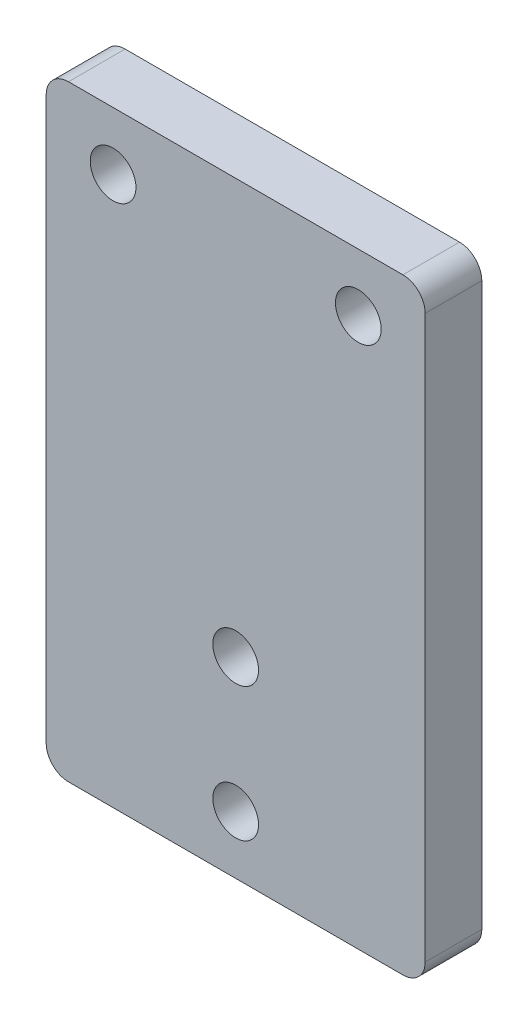
ISO-10303-21;
HEADER;
FILE_DESCRIPTION(('STEP AP214'),'2;1');
FILE_NAME('part.step','',(''),(''),'','','');
FILE_SCHEMA(('AUTOMOTIVE_DESIGN { 1 0 10303 214 1 1 1 1 }'));
ENDSEC;
DATA;
#1=APPLICATION_CONTEXT('core data for automotive mechanical design processes');
#2=APPLICATION_PROTOCOL_DEFINITION('international standard','automotive_design',2000,#1);
#3=PRODUCT_CONTEXT('',#1,'mechanical');
#4=PRODUCT('Part','Part','',(#3));
#5=PRODUCT_RELATED_PRODUCT_CATEGORY('part','',(#4));
#6=PRODUCT_DEFINITION_FORMATION('','',#4);
#7=PRODUCT_DEFINITION_CONTEXT('part definition',#1,'design');
#8=PRODUCT_DEFINITION('design','',#6,#7);
#9=PRODUCT_DEFINITION_SHAPE('','',#8);
#10=(LENGTH_UNIT() NAMED_UNIT(*) SI_UNIT(.MILLI.,.METRE.));
#11=(NAMED_UNIT(*) PLANE_ANGLE_UNIT() SI_UNIT($,.RADIAN.));
#12=(NAMED_UNIT(*) SI_UNIT($,.STERADIAN.) SOLID_ANGLE_UNIT());
#13=UNCERTAINTY_MEASURE_WITH_UNIT(LENGTH_MEASURE(1.E-05),#10,'distance_accuracy_value','');
#14=(GEOMETRIC_REPRESENTATION_CONTEXT(3) GLOBAL_UNCERTAINTY_ASSIGNED_CONTEXT((#13)) GLOBAL_UNIT_ASSIGNED_CONTEXT((#10,
#11,#12)) REPRESENTATION_CONTEXT('',''));
#15=CARTESIAN_POINT('',(0.,0.,0.));
#16=DIRECTION('',(0.,0.,1.));
#17=DIRECTION('',(1.,0.,0.));
#18=AXIS2_PLACEMENT_3D('',#15,#16,#17);
#19=CARTESIAN_POINT('',(37.5,-63.,6.35));
#20=DIRECTION('',(0.,0.,1.));
#21=DIRECTION('',(1.,0.,0.));
#22=AXIS2_PLACEMENT_3D('',#19,#20,#21);
#23=PLANE('',#22);
#24=CARTESIAN_POINT('',(-27.5,55.,6.35));
#25=DIRECTION('',(0.,0.,1.));
#26=DIRECTION('',(1.,0.,0.));
#27=AXIS2_PLACEMENT_3D('',#24,#25,#26);
#28=CIRCLE('',#27,5.125);
#29=CARTESIAN_POINT('',(-22.375,55.,6.35));
#30=VERTEX_POINT('',#29);
#31=EDGE_CURVE('E188',#30,#30,#28,.T.);
#32=ORIENTED_EDGE('',*,*,#31,.F.);
#33=EDGE_LOOP('',(#32));
#34=FACE_BOUND('',#33,.T.);
#35=CARTESIAN_POINT('',(0.,-55.,6.35));
#36=DIRECTION('',(0.,0.,1.));
#37=DIRECTION('',(1.,0.,0.));
#38=AXIS2_PLACEMENT_3D('',#35,#36,#37);
#39=CIRCLE('',#38,5.125);
#40=CARTESIAN_POINT('',(5.12500000000001,-55.,6.35));
#41=VERTEX_POINT('',#40);
#42=EDGE_CURVE('E134',#41,#41,#39,.T.);
#43=ORIENTED_EDGE('',*,*,#42,.F.);
#44=EDGE_LOOP('',(#43));
#45=FACE_BOUND('',#44,.T.);
#46=CARTESIAN_POINT('',(37.5,-63.,6.35));
#47=DIRECTION('',(0.,0.,1.));
#48=DIRECTION('',(1.,0.,0.));
#49=AXIS2_PLACEMENT_3D('',#46,#47,#48);
#50=CIRCLE('',#49,5.);
#51=CARTESIAN_POINT('',(37.5,-68.,6.35));
#52=VERTEX_POINT('',#51);
#53=CARTESIAN_POINT('',(42.5,-63.,6.35));
#54=VERTEX_POINT('',#53);
#55=EDGE_CURVE('E145',#52,#54,#50,.T.);
#56=ORIENTED_EDGE('',*,*,#55,.T.);
#57=DIRECTION('',(0.,1.,0.));
#58=VECTOR('',#57,1.);
#59=CARTESIAN_POINT('',(42.5,63.,6.35));
#60=LINE('',#59,#58);
#61=CARTESIAN_POINT('',(42.5,63.,6.35));
#62=VERTEX_POINT('',#61);
#63=EDGE_CURVE('E93',#54,#62,#60,.T.);
#64=ORIENTED_EDGE('',*,*,#63,.T.);
#65=CARTESIAN_POINT('',(37.5,63.,6.35));
#66=DIRECTION('',(0.,0.,1.));
#67=DIRECTION('',(-1.,0.,0.));
#68=AXIS2_PLACEMENT_3D('',#65,#66,#67);
#69=CIRCLE('',#68,5.);
#70=CARTESIAN_POINT('',(37.5,68.,6.35));
#71=VERTEX_POINT('',#70);
#72=EDGE_CURVE('E160',#62,#71,#69,.T.);
#73=ORIENTED_EDGE('',*,*,#72,.T.);
#74=DIRECTION('',(-1.,0.,0.));
#75=VECTOR('',#74,1.);
#76=CARTESIAN_POINT('',(-37.5,68.,6.35));
#77=LINE('',#76,#75);
#78=CARTESIAN_POINT('',(-37.5,68.,6.35));
#79=VERTEX_POINT('',#78);
#80=EDGE_CURVE('E173',#71,#79,#77,.T.);
#81=ORIENTED_EDGE('',*,*,#80,.T.);
#82=CARTESIAN_POINT('',(-37.5,63.,6.35));
#83=DIRECTION('',(0.,0.,1.));
#84=DIRECTION('',(1.,0.,0.));
#85=AXIS2_PLACEMENT_3D('',#82,#83,#84);
#86=CIRCLE('',#85,5.);
#87=CARTESIAN_POINT('',(-42.5,63.,6.35));
#88=VERTEX_POINT('',#87);
#89=EDGE_CURVE('E112',#79,#88,#86,.T.);
#90=ORIENTED_EDGE('',*,*,#89,.T.);
#91=DIRECTION('',(0.,-1.,0.));
#92=VECTOR('',#91,1.);
#93=CARTESIAN_POINT('',(-42.5,63.,6.35));
#94=LINE('',#93,#92);
#95=CARTESIAN_POINT('',(-42.5,-63.,6.35));
#96=VERTEX_POINT('',#95);
#97=EDGE_CURVE('E106',#88,#96,#94,.T.);
#98=ORIENTED_EDGE('',*,*,#97,.T.);
#99=CARTESIAN_POINT('',(-37.5,-63.,6.35));
#100=DIRECTION('',(0.,0.,1.));
#101=DIRECTION('',(1.,0.,0.));
#102=AXIS2_PLACEMENT_3D('',#99,#100,#101);
#103=CIRCLE('',#102,5.);
#104=CARTESIAN_POINT('',(-37.5,-68.,6.35));
#105=VERTEX_POINT('',#104);
#106=EDGE_CURVE('E110',#96,#105,#103,.T.);
#107=ORIENTED_EDGE('',*,*,#106,.T.);
#108=DIRECTION('',(1.,0.,0.));
#109=VECTOR('',#108,1.);
#110=CARTESIAN_POINT('',(-37.5,-68.,6.35));
#111=LINE('',#110,#109);
#112=EDGE_CURVE('E50',#105,#52,#111,.T.);
#113=ORIENTED_EDGE('',*,*,#112,.T.);
#114=EDGE_LOOP('',(#56,#64,#73,#81,#90,#98,#107,#113));
#115=FACE_BOUND('',#114,.T.);
#116=CARTESIAN_POINT('',(0.,-25.,6.35));
#117=DIRECTION('',(0.,0.,1.));
#118=DIRECTION('',(1.,0.,0.));
#119=AXIS2_PLACEMENT_3D('',#116,#117,#118);
#120=CIRCLE('',#119,5.125);
#121=CARTESIAN_POINT('',(5.125,-25.,6.35));
#122=VERTEX_POINT('',#121);
#123=EDGE_CURVE('E182',#122,#122,#120,.T.);
#124=ORIENTED_EDGE('',*,*,#123,.F.);
#125=EDGE_LOOP('',(#124));
#126=FACE_BOUND('',#125,.T.);
#127=CARTESIAN_POINT('',(27.5,55.,6.35));
#128=DIRECTION('',(0.,0.,1.));
#129=DIRECTION('',(-1.,0.,0.));
#130=AXIS2_PLACEMENT_3D('',#127,#128,#129);
#131=CIRCLE('',#130,5.125);
#132=CARTESIAN_POINT('',(22.375,55.,6.35));
#133=VERTEX_POINT('',#132);
#134=EDGE_CURVE('E194',#133,#133,#131,.T.);
#135=ORIENTED_EDGE('',*,*,#134,.F.);
#136=EDGE_LOOP('',(#135));
#137=FACE_BOUND('',#136,.T.);
#138=ADVANCED_FACE('F33',(#34,#45,#115,#126,#137),#23,.T.);
#139=CARTESIAN_POINT('',(37.5,-63.,-6.35));
#140=DIRECTION('',(0.,0.,1.));
#141=DIRECTION('',(1.,0.,0.));
#142=AXIS2_PLACEMENT_3D('',#139,#140,#141);
#143=PLANE('',#142);
#144=CARTESIAN_POINT('',(37.5,-63.,-6.35));
#145=DIRECTION('',(0.,0.,1.));
#146=DIRECTION('',(1.,0.,0.));
#147=AXIS2_PLACEMENT_3D('',#144,#145,#146);
#148=CIRCLE('',#147,5.);
#149=CARTESIAN_POINT('',(37.5,-68.,-6.35));
#150=VERTEX_POINT('',#149);
#151=CARTESIAN_POINT('',(42.5,-63.,-6.35));
#152=VERTEX_POINT('',#151);
#153=EDGE_CURVE('E130',#150,#152,#148,.T.);
#154=ORIENTED_EDGE('',*,*,#153,.F.);
#155=DIRECTION('',(1.,0.,0.));
#156=VECTOR('',#155,1.);
#157=CARTESIAN_POINT('',(-37.5,-68.,-6.35));
#158=LINE('',#157,#156);
#159=CARTESIAN_POINT('',(-37.5,-68.,-6.35));
#160=VERTEX_POINT('',#159);
#161=EDGE_CURVE('E85',#160,#150,#158,.T.);
#162=ORIENTED_EDGE('',*,*,#161,.F.);
#163=CARTESIAN_POINT('',(-37.5,-63.,-6.35));
#164=DIRECTION('',(0.,0.,1.));
#165=DIRECTION('',(1.,0.,0.));
#166=AXIS2_PLACEMENT_3D('',#163,#164,#165);
#167=CIRCLE('',#166,5.);
#168=CARTESIAN_POINT('',(-42.5,-63.,-6.35));
#169=VERTEX_POINT('',#168);
#170=EDGE_CURVE('E79',#169,#160,#167,.T.);
#171=ORIENTED_EDGE('',*,*,#170,.F.);
#172=DIRECTION('',(0.,-1.,0.));
#173=VECTOR('',#172,1.);
#174=CARTESIAN_POINT('',(-42.5,63.,-6.35));
#175=LINE('',#174,#173);
#176=CARTESIAN_POINT('',(-42.5,63.,-6.35));
#177=VERTEX_POINT('',#176);
#178=EDGE_CURVE('E120',#177,#169,#175,.T.);
#179=ORIENTED_EDGE('',*,*,#178,.F.);
#180=CARTESIAN_POINT('',(-37.5,63.,-6.35));
#181=DIRECTION('',(0.,0.,1.));
#182=DIRECTION('',(1.,0.,0.));
#183=AXIS2_PLACEMENT_3D('',#180,#181,#182);
#184=CIRCLE('',#183,5.);
#185=CARTESIAN_POINT('',(-37.5,68.,-6.35));
#186=VERTEX_POINT('',#185);
#187=EDGE_CURVE('E140',#186,#177,#184,.T.);
#188=ORIENTED_EDGE('',*,*,#187,.F.);
#189=DIRECTION('',(-1.,0.,0.));
#190=VECTOR('',#189,1.);
#191=CARTESIAN_POINT('',(-37.5,68.,-6.35));
#192=LINE('',#191,#190);
#193=CARTESIAN_POINT('',(37.5,68.,-6.35));
#194=VERTEX_POINT('',#193);
#195=EDGE_CURVE('E138',#194,#186,#192,.T.);
#196=ORIENTED_EDGE('',*,*,#195,.F.);
#197=CARTESIAN_POINT('',(37.5,63.,-6.35));
#198=DIRECTION('',(0.,0.,1.));
#199=DIRECTION('',(-1.,0.,0.));
#200=AXIS2_PLACEMENT_3D('',#197,#198,#199);
#201=CIRCLE('',#200,5.);
#202=CARTESIAN_POINT('',(42.5,63.,-6.35));
#203=VERTEX_POINT('',#202);
#204=EDGE_CURVE('E136',#203,#194,#201,.T.);
#205=ORIENTED_EDGE('',*,*,#204,.F.);
#206=DIRECTION('',(0.,1.,0.));
#207=VECTOR('',#206,1.);
#208=CARTESIAN_POINT('',(42.5,63.,-6.35));
#209=LINE('',#208,#207);
#210=EDGE_CURVE('E133',#152,#203,#209,.T.);
#211=ORIENTED_EDGE('',*,*,#210,.F.);
#212=EDGE_LOOP('',(#154,#162,#171,#179,#188,#196,#205,#211));
#213=FACE_BOUND('',#212,.T.);
#214=CARTESIAN_POINT('',(0.,-55.,-6.35));
#215=DIRECTION('',(0.,0.,1.));
#216=DIRECTION('',(1.,0.,0.));
#217=AXIS2_PLACEMENT_3D('',#214,#215,#216);
#218=CIRCLE('',#217,5.125);
#219=CARTESIAN_POINT('',(5.12500000000001,-55.,-6.35));
#220=VERTEX_POINT('',#219);
#221=EDGE_CURVE('E179',#220,#220,#218,.T.);
#222=ORIENTED_EDGE('',*,*,#221,.T.);
#223=EDGE_LOOP('',(#222));
#224=FACE_BOUND('',#223,.T.);
#225=CARTESIAN_POINT('',(0.,-25.,-6.35));
#226=DIRECTION('',(0.,0.,1.));
#227=DIRECTION('',(1.,0.,0.));
#228=AXIS2_PLACEMENT_3D('',#225,#226,#227);
#229=CIRCLE('',#228,5.125);
#230=CARTESIAN_POINT('',(5.125,-25.,-6.35));
#231=VERTEX_POINT('',#230);
#232=EDGE_CURVE('E185',#231,#231,#229,.T.);
#233=ORIENTED_EDGE('',*,*,#232,.T.);
#234=EDGE_LOOP('',(#233));
#235=FACE_BOUND('',#234,.T.);
#236=CARTESIAN_POINT('',(-27.5,55.,-6.35));
#237=DIRECTION('',(0.,0.,1.));
#238=DIRECTION('',(1.,0.,0.));
#239=AXIS2_PLACEMENT_3D('',#236,#237,#238);
#240=CIRCLE('',#239,5.125);
#241=CARTESIAN_POINT('',(-22.375,55.,-6.35));
#242=VERTEX_POINT('',#241);
#243=EDGE_CURVE('E191',#242,#242,#240,.T.);
#244=ORIENTED_EDGE('',*,*,#243,.T.);
#245=EDGE_LOOP('',(#244));
#246=FACE_BOUND('',#245,.T.);
#247=CARTESIAN_POINT('',(27.5,55.,-6.35));
#248=DIRECTION('',(0.,0.,1.));
#249=DIRECTION('',(-1.,0.,0.));
#250=AXIS2_PLACEMENT_3D('',#247,#248,#249);
#251=CIRCLE('',#250,5.125);
#252=CARTESIAN_POINT('',(22.375,55.,-6.35));
#253=VERTEX_POINT('',#252);
#254=EDGE_CURVE('E197',#253,#253,#251,.T.);
#255=ORIENTED_EDGE('',*,*,#254,.T.);
#256=EDGE_LOOP('',(#255));
#257=FACE_BOUND('',#256,.T.);
#258=ADVANCED_FACE('F164',(#213,#224,#235,#246,#257),#143,.F.);
#259=CARTESIAN_POINT('',(37.5,-63.,6.35));
#260=DIRECTION('',(0.,0.,-1.));
#261=DIRECTION('',(-1.,0.,0.));
#262=AXIS2_PLACEMENT_3D('',#259,#260,#261);
#263=CYLINDRICAL_SURFACE('',#262,5.);
#264=ORIENTED_EDGE('',*,*,#153,.T.);
#265=DIRECTION('',(0.,0.,-1.));
#266=VECTOR('',#265,1.);
#267=CARTESIAN_POINT('',(42.5,-63.,6.35));
#268=LINE('',#267,#266);
#269=EDGE_CURVE('E11',#54,#152,#268,.T.);
#270=ORIENTED_EDGE('',*,*,#269,.F.);
#271=ORIENTED_EDGE('',*,*,#55,.F.);
#272=DIRECTION('',(0.,0.,-1.));
#273=VECTOR('',#272,1.);
#274=CARTESIAN_POINT('',(37.5,-68.,6.35));
#275=LINE('',#274,#273);
#276=EDGE_CURVE('E126',#52,#150,#275,.T.);
#277=ORIENTED_EDGE('',*,*,#276,.T.);
#278=EDGE_LOOP('',(#264,#270,#271,#277));
#279=FACE_BOUND('',#278,.T.);
#280=ADVANCED_FACE('F35',(#279),#263,.T.);
#281=CARTESIAN_POINT('',(42.5,63.,6.35));
#282=DIRECTION('',(-1.,0.,0.));
#283=DIRECTION('',(0.,-1.,0.));
#284=AXIS2_PLACEMENT_3D('',#281,#282,#283);
#285=PLANE('',#284);
#286=ORIENTED_EDGE('',*,*,#210,.T.);
#287=DIRECTION('',(0.,0.,-1.));
#288=VECTOR('',#287,1.);
#289=CARTESIAN_POINT('',(42.5,63.,6.35));
#290=LINE('',#289,#288);
#291=EDGE_CURVE('E42',#62,#203,#290,.T.);
#292=ORIENTED_EDGE('',*,*,#291,.F.);
#293=ORIENTED_EDGE('',*,*,#63,.F.);
#294=ORIENTED_EDGE('',*,*,#269,.T.);
#295=EDGE_LOOP('',(#286,#292,#293,#294));
#296=FACE_BOUND('',#295,.T.);
#297=ADVANCED_FACE('F231',(#296),#285,.F.);
#298=CARTESIAN_POINT('',(37.5,63.,6.35));
#299=DIRECTION('',(0.,0.,-1.));
#300=DIRECTION('',(-1.,0.,0.));
#301=AXIS2_PLACEMENT_3D('',#298,#299,#300);
#302=CYLINDRICAL_SURFACE('',#301,5.);
#303=ORIENTED_EDGE('',*,*,#204,.T.);
#304=DIRECTION('',(0.,0.,-1.));
#305=VECTOR('',#304,1.);
#306=CARTESIAN_POINT('',(37.5,68.,6.35));
#307=LINE('',#306,#305);
#308=EDGE_CURVE('E152',#71,#194,#307,.T.);
#309=ORIENTED_EDGE('',*,*,#308,.F.);
#310=ORIENTED_EDGE('',*,*,#72,.F.);
#311=ORIENTED_EDGE('',*,*,#291,.T.);
#312=EDGE_LOOP('',(#303,#309,#310,#311));
#313=FACE_BOUND('',#312,.T.);
#314=ADVANCED_FACE('F158',(#313),#302,.T.);
#315=CARTESIAN_POINT('',(-37.5,68.,6.35));
#316=DIRECTION('',(0.,-1.,0.));
#317=DIRECTION('',(0.,0.,-1.));
#318=AXIS2_PLACEMENT_3D('',#315,#316,#317);
#319=PLANE('',#318);
#320=ORIENTED_EDGE('',*,*,#195,.T.);
#321=DIRECTION('',(0.,0.,-1.));
#322=VECTOR('',#321,1.);
#323=CARTESIAN_POINT('',(-37.5,68.,6.35));
#324=LINE('',#323,#322);
#325=EDGE_CURVE('E149',#79,#186,#324,.T.);
#326=ORIENTED_EDGE('',*,*,#325,.F.);
#327=ORIENTED_EDGE('',*,*,#80,.F.);
#328=ORIENTED_EDGE('',*,*,#308,.T.);
#329=EDGE_LOOP('',(#320,#326,#327,#328));
#330=FACE_BOUND('',#329,.T.);
#331=ADVANCED_FACE('F169',(#330),#319,.F.);
#332=CARTESIAN_POINT('',(-37.5,63.,6.35));
#333=DIRECTION('',(0.,0.,-1.));
#334=DIRECTION('',(-1.,0.,0.));
#335=AXIS2_PLACEMENT_3D('',#332,#333,#334);
#336=CYLINDRICAL_SURFACE('',#335,5.);
#337=ORIENTED_EDGE('',*,*,#187,.T.);
#338=DIRECTION('',(0.,0.,-1.));
#339=VECTOR('',#338,1.);
#340=CARTESIAN_POINT('',(-42.5,63.,6.35));
#341=LINE('',#340,#339);
#342=EDGE_CURVE('E121',#88,#177,#341,.T.);
#343=ORIENTED_EDGE('',*,*,#342,.F.);
#344=ORIENTED_EDGE('',*,*,#89,.F.);
#345=ORIENTED_EDGE('',*,*,#325,.T.);
#346=EDGE_LOOP('',(#337,#343,#344,#345));
#347=FACE_BOUND('',#346,.T.);
#348=ADVANCED_FACE('F172',(#347),#336,.T.);
#349=CARTESIAN_POINT('',(-42.5,63.,6.35));
#350=DIRECTION('',(1.,0.,0.));
#351=DIRECTION('',(0.,1.,0.));
#352=AXIS2_PLACEMENT_3D('',#349,#350,#351);
#353=PLANE('',#352);
#354=ORIENTED_EDGE('',*,*,#178,.T.);
#355=DIRECTION('',(0.,0.,-1.));
#356=VECTOR('',#355,1.);
#357=CARTESIAN_POINT('',(-42.5,-63.,6.35));
#358=LINE('',#357,#356);
#359=EDGE_CURVE('E117',#96,#169,#358,.T.);
#360=ORIENTED_EDGE('',*,*,#359,.F.);
#361=ORIENTED_EDGE('',*,*,#97,.F.);
#362=ORIENTED_EDGE('',*,*,#342,.T.);
#363=EDGE_LOOP('',(#354,#360,#361,#362));
#364=FACE_BOUND('',#363,.T.);
#365=ADVANCED_FACE('F118',(#364),#353,.F.);
#366=CARTESIAN_POINT('',(-37.5,-63.,6.35));
#367=DIRECTION('',(0.,0.,-1.));
#368=DIRECTION('',(-1.,0.,0.));
#369=AXIS2_PLACEMENT_3D('',#366,#367,#368);
#370=CYLINDRICAL_SURFACE('',#369,5.);
#371=ORIENTED_EDGE('',*,*,#170,.T.);
#372=DIRECTION('',(0.,0.,-1.));
#373=VECTOR('',#372,1.);
#374=CARTESIAN_POINT('',(-37.5,-68.,6.35));
#375=LINE('',#374,#373);
#376=EDGE_CURVE('E122',#105,#160,#375,.T.);
#377=ORIENTED_EDGE('',*,*,#376,.F.);
#378=ORIENTED_EDGE('',*,*,#106,.F.);
#379=ORIENTED_EDGE('',*,*,#359,.T.);
#380=EDGE_LOOP('',(#371,#377,#378,#379));
#381=FACE_BOUND('',#380,.T.);
#382=ADVANCED_FACE('F124',(#381),#370,.T.);
#383=CARTESIAN_POINT('',(-37.5,-68.,6.35));
#384=DIRECTION('',(0.,1.,0.));
#385=DIRECTION('',(0.,0.,1.));
#386=AXIS2_PLACEMENT_3D('',#383,#384,#385);
#387=PLANE('',#386);
#388=ORIENTED_EDGE('',*,*,#161,.T.);
#389=ORIENTED_EDGE('',*,*,#276,.F.);
#390=ORIENTED_EDGE('',*,*,#112,.F.);
#391=ORIENTED_EDGE('',*,*,#376,.T.);
#392=EDGE_LOOP('',(#388,#389,#390,#391));
#393=FACE_BOUND('',#392,.T.);
#394=ADVANCED_FACE('F219',(#393),#387,.F.);
#395=CARTESIAN_POINT('',(0.,-55.,6.35));
#396=DIRECTION('',(0.,0.,-1.));
#397=DIRECTION('',(-1.,0.,0.));
#398=AXIS2_PLACEMENT_3D('',#395,#396,#397);
#399=CYLINDRICAL_SURFACE('',#398,5.125);
#400=ORIENTED_EDGE('',*,*,#42,.T.);
#401=EDGE_LOOP('',(#400));
#402=FACE_BOUND('',#401,.T.);
#403=ORIENTED_EDGE('',*,*,#221,.F.);
#404=EDGE_LOOP('',(#403));
#405=FACE_BOUND('',#404,.T.);
#406=ADVANCED_FACE('F216',(#402,#405),#399,.F.);
#407=CARTESIAN_POINT('',(0.,-25.,6.35));
#408=DIRECTION('',(0.,0.,-1.));
#409=DIRECTION('',(-1.,0.,0.));
#410=AXIS2_PLACEMENT_3D('',#407,#408,#409);
#411=CYLINDRICAL_SURFACE('',#410,5.125);
#412=ORIENTED_EDGE('',*,*,#123,.T.);
#413=EDGE_LOOP('',(#412));
#414=FACE_BOUND('',#413,.T.);
#415=ORIENTED_EDGE('',*,*,#232,.F.);
#416=EDGE_LOOP('',(#415));
#417=FACE_BOUND('',#416,.T.);
#418=ADVANCED_FACE('F295',(#414,#417),#411,.F.);
#419=CARTESIAN_POINT('',(-27.5,55.,6.35));
#420=DIRECTION('',(0.,0.,-1.));
#421=DIRECTION('',(-1.,0.,0.));
#422=AXIS2_PLACEMENT_3D('',#419,#420,#421);
#423=CYLINDRICAL_SURFACE('',#422,5.125);
#424=ORIENTED_EDGE('',*,*,#31,.T.);
#425=EDGE_LOOP('',(#424));
#426=FACE_BOUND('',#425,.T.);
#427=ORIENTED_EDGE('',*,*,#243,.F.);
#428=EDGE_LOOP('',(#427));
#429=FACE_BOUND('',#428,.T.);
#430=ADVANCED_FACE('F303',(#426,#429),#423,.F.);
#431=CARTESIAN_POINT('',(27.5,55.,6.35));
#432=DIRECTION('',(0.,0.,-1.));
#433=DIRECTION('',(-1.,0.,0.));
#434=AXIS2_PLACEMENT_3D('',#431,#432,#433);
#435=CYLINDRICAL_SURFACE('',#434,5.125);
#436=ORIENTED_EDGE('',*,*,#134,.T.);
#437=EDGE_LOOP('',(#436));
#438=FACE_BOUND('',#437,.T.);
#439=ORIENTED_EDGE('',*,*,#254,.F.);
#440=EDGE_LOOP('',(#439));
#441=FACE_BOUND('',#440,.T.);
#442=ADVANCED_FACE('F203',(#438,#441),#435,.F.);
#443=CLOSED_SHELL('',(#138,#258,#280,#297,#314,#331,#348,#365,#382,#394,#406,#418,#430,#442));
#444=MANIFOLD_SOLID_BREP('B2',#443);
#445=ADVANCED_BREP_SHAPE_REPRESENTATION('',(#18,#444),#14);
#446=SHAPE_DEFINITION_REPRESENTATION(#9,#445);
ENDSEC;
END-ISO-10303-21;
